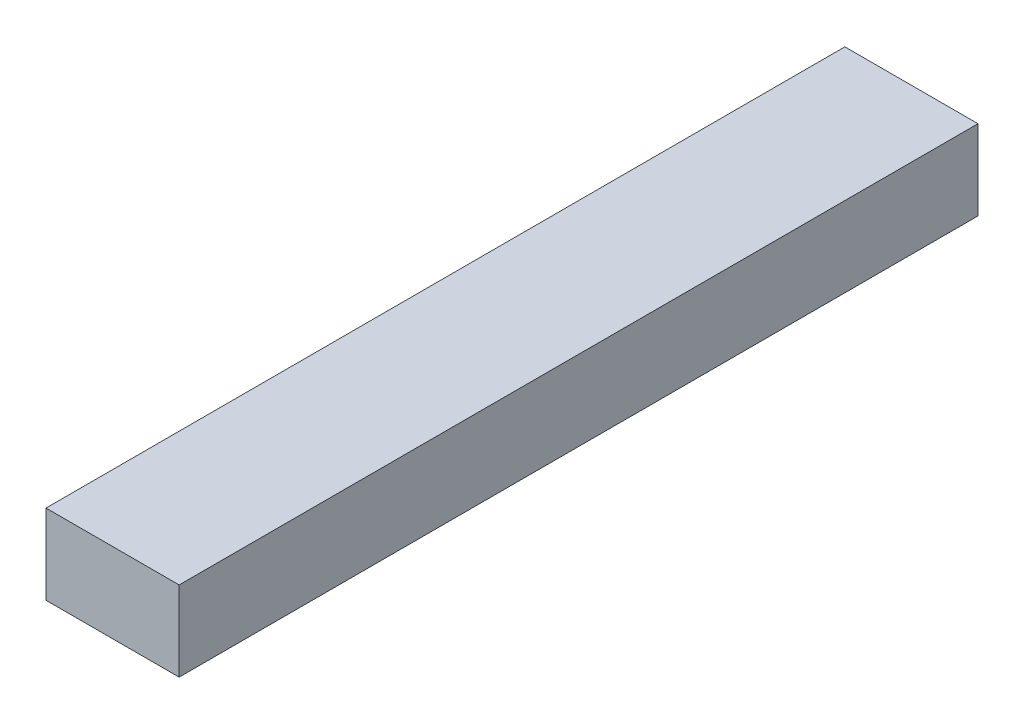
ISO-10303-21;
HEADER;
FILE_DESCRIPTION(('STEP AP214'),'2;1');
FILE_NAME('part.step','',(''),(''),'','','');
FILE_SCHEMA(('AUTOMOTIVE_DESIGN { 1 0 10303 214 1 1 1 1 }'));
ENDSEC;
DATA;
#1=APPLICATION_CONTEXT('core data for automotive mechanical design processes');
#2=APPLICATION_PROTOCOL_DEFINITION('international standard','automotive_design',2000,#1);
#3=PRODUCT_CONTEXT('',#1,'mechanical');
#4=PRODUCT('Part','Part','',(#3));
#5=PRODUCT_RELATED_PRODUCT_CATEGORY('part','',(#4));
#6=PRODUCT_DEFINITION_FORMATION('','',#4);
#7=PRODUCT_DEFINITION_CONTEXT('part definition',#1,'design');
#8=PRODUCT_DEFINITION('design','',#6,#7);
#9=PRODUCT_DEFINITION_SHAPE('','',#8);
#10=(LENGTH_UNIT() NAMED_UNIT(*) SI_UNIT(.MILLI.,.METRE.));
#11=(NAMED_UNIT(*) PLANE_ANGLE_UNIT() SI_UNIT($,.RADIAN.));
#12=(NAMED_UNIT(*) SI_UNIT($,.STERADIAN.) SOLID_ANGLE_UNIT());
#13=UNCERTAINTY_MEASURE_WITH_UNIT(LENGTH_MEASURE(1.E-05),#10,'distance_accuracy_value','');
#14=(GEOMETRIC_REPRESENTATION_CONTEXT(3) GLOBAL_UNCERTAINTY_ASSIGNED_CONTEXT((#13)) GLOBAL_UNIT_ASSIGNED_CONTEXT((#10,
#11,#12)) REPRESENTATION_CONTEXT('',''));
#15=CARTESIAN_POINT('',(0.,0.,0.));
#16=DIRECTION('',(0.,0.,1.));
#17=DIRECTION('',(1.,0.,0.));
#18=AXIS2_PLACEMENT_3D('',#15,#16,#17);
#19=CARTESIAN_POINT('',(-31.75,-19.05,190.5));
#20=DIRECTION('',(1.,0.,0.));
#21=DIRECTION('',(0.,0.,-1.));
#22=AXIS2_PLACEMENT_3D('',#19,#20,#21);
#23=PLANE('',#22);
#24=DIRECTION('',(0.,-1.,0.));
#25=VECTOR('',#24,1.);
#26=CARTESIAN_POINT('',(-31.75,-19.05,-190.5));
#27=LINE('',#26,#25);
#28=CARTESIAN_POINT('',(-31.75,19.05,-190.5));
#29=VERTEX_POINT('',#28);
#30=CARTESIAN_POINT('',(-31.75,-19.05,-190.5));
#31=VERTEX_POINT('',#30);
#32=EDGE_CURVE('E117',#29,#31,#27,.T.);
#33=ORIENTED_EDGE('',*,*,#32,.T.);
#34=DIRECTION('',(0.,0.,-1.));
#35=VECTOR('',#34,1.);
#36=CARTESIAN_POINT('',(-31.75,-19.05,190.5));
#37=LINE('',#36,#35);
#38=CARTESIAN_POINT('',(-31.75,-19.05,190.5));
#39=VERTEX_POINT('',#38);
#40=EDGE_CURVE('E11',#39,#31,#37,.T.);
#41=ORIENTED_EDGE('',*,*,#40,.F.);
#42=DIRECTION('',(0.,-1.,0.));
#43=VECTOR('',#42,1.);
#44=CARTESIAN_POINT('',(-31.75,-19.05,190.5));
#45=LINE('',#44,#43);
#46=CARTESIAN_POINT('',(-31.75,19.05,190.5));
#47=VERTEX_POINT('',#46);
#48=EDGE_CURVE('E101',#47,#39,#45,.T.);
#49=ORIENTED_EDGE('',*,*,#48,.F.);
#50=DIRECTION('',(0.,0.,-1.));
#51=VECTOR('',#50,1.);
#52=CARTESIAN_POINT('',(-31.75,19.05,190.5));
#53=LINE('',#52,#51);
#54=EDGE_CURVE('E113',#47,#29,#53,.T.);
#55=ORIENTED_EDGE('',*,*,#54,.T.);
#56=EDGE_LOOP('',(#33,#41,#49,#55));
#57=FACE_BOUND('',#56,.T.);
#58=ADVANCED_FACE('F49',(#57),#23,.F.);
#59=CARTESIAN_POINT('',(31.75,-19.05,190.5));
#60=DIRECTION('',(0.,1.,0.));
#61=DIRECTION('',(-1.,0.,0.));
#62=AXIS2_PLACEMENT_3D('',#59,#60,#61);
#63=PLANE('',#62);
#64=DIRECTION('',(1.,0.,0.));
#65=VECTOR('',#64,1.);
#66=CARTESIAN_POINT('',(31.75,-19.05,-190.5));
#67=LINE('',#66,#65);
#68=CARTESIAN_POINT('',(31.75,-19.05,-190.5));
#69=VERTEX_POINT('',#68);
#70=EDGE_CURVE('E106',#31,#69,#67,.T.);
#71=ORIENTED_EDGE('',*,*,#70,.T.);
#72=DIRECTION('',(0.,0.,-1.));
#73=VECTOR('',#72,1.);
#74=CARTESIAN_POINT('',(31.75,-19.05,190.5));
#75=LINE('',#74,#73);
#76=CARTESIAN_POINT('',(31.75,-19.05,190.5));
#77=VERTEX_POINT('',#76);
#78=EDGE_CURVE('E58',#77,#69,#75,.T.);
#79=ORIENTED_EDGE('',*,*,#78,.F.);
#80=DIRECTION('',(1.,0.,0.));
#81=VECTOR('',#80,1.);
#82=CARTESIAN_POINT('',(31.75,-19.05,190.5));
#83=LINE('',#82,#81);
#84=EDGE_CURVE('E96',#39,#77,#83,.T.);
#85=ORIENTED_EDGE('',*,*,#84,.F.);
#86=ORIENTED_EDGE('',*,*,#40,.T.);
#87=EDGE_LOOP('',(#71,#79,#85,#86));
#88=FACE_BOUND('',#87,.T.);
#89=ADVANCED_FACE('F105',(#88),#63,.F.);
#90=CARTESIAN_POINT('',(31.75,-19.05,190.5));
#91=DIRECTION('',(-1.,0.,0.));
#92=DIRECTION('',(0.,0.,1.));
#93=AXIS2_PLACEMENT_3D('',#90,#91,#92);
#94=PLANE('',#93);
#95=DIRECTION('',(0.,1.,0.));
#96=VECTOR('',#95,1.);
#97=CARTESIAN_POINT('',(31.75,-19.05,-190.5));
#98=LINE('',#97,#96);
#99=CARTESIAN_POINT('',(31.75,19.05,-190.5));
#100=VERTEX_POINT('',#99);
#101=EDGE_CURVE('E83',#69,#100,#98,.T.);
#102=ORIENTED_EDGE('',*,*,#101,.T.);
#103=DIRECTION('',(0.,0.,-1.));
#104=VECTOR('',#103,1.);
#105=CARTESIAN_POINT('',(31.75,19.05,190.5));
#106=LINE('',#105,#104);
#107=CARTESIAN_POINT('',(31.75,19.05,190.5));
#108=VERTEX_POINT('',#107);
#109=EDGE_CURVE('E108',#108,#100,#106,.T.);
#110=ORIENTED_EDGE('',*,*,#109,.F.);
#111=DIRECTION('',(0.,1.,0.));
#112=VECTOR('',#111,1.);
#113=CARTESIAN_POINT('',(31.75,-19.05,190.5));
#114=LINE('',#113,#112);
#115=EDGE_CURVE('E99',#77,#108,#114,.T.);
#116=ORIENTED_EDGE('',*,*,#115,.F.);
#117=ORIENTED_EDGE('',*,*,#78,.T.);
#118=EDGE_LOOP('',(#102,#110,#116,#117));
#119=FACE_BOUND('',#118,.T.);
#120=ADVANCED_FACE('F109',(#119),#94,.F.);
#121=CARTESIAN_POINT('',(31.75,19.05,190.5));
#122=DIRECTION('',(0.,-1.,0.));
#123=DIRECTION('',(1.,0.,0.));
#124=AXIS2_PLACEMENT_3D('',#121,#122,#123);
#125=PLANE('',#124);
#126=DIRECTION('',(-1.,0.,0.));
#127=VECTOR('',#126,1.);
#128=CARTESIAN_POINT('',(31.75,19.05,-190.5));
#129=LINE('',#128,#127);
#130=EDGE_CURVE('E89',#100,#29,#129,.T.);
#131=ORIENTED_EDGE('',*,*,#130,.T.);
#132=ORIENTED_EDGE('',*,*,#54,.F.);
#133=DIRECTION('',(-1.,0.,0.));
#134=VECTOR('',#133,1.);
#135=CARTESIAN_POINT('',(31.75,19.05,190.5));
#136=LINE('',#135,#134);
#137=EDGE_CURVE('E66',#108,#47,#136,.T.);
#138=ORIENTED_EDGE('',*,*,#137,.F.);
#139=ORIENTED_EDGE('',*,*,#109,.T.);
#140=EDGE_LOOP('',(#131,#132,#138,#139));
#141=FACE_BOUND('',#140,.T.);
#142=ADVANCED_FACE('F130',(#141),#125,.F.);
#143=CARTESIAN_POINT('',(0.,0.,190.5));
#144=DIRECTION('',(0.,0.,1.));
#145=DIRECTION('',(1.,0.,0.));
#146=AXIS2_PLACEMENT_3D('',#143,#144,#145);
#147=PLANE('',#146);
#148=ORIENTED_EDGE('',*,*,#48,.T.);
#149=ORIENTED_EDGE('',*,*,#84,.T.);
#150=ORIENTED_EDGE('',*,*,#115,.T.);
#151=ORIENTED_EDGE('',*,*,#137,.T.);
#152=EDGE_LOOP('',(#148,#149,#150,#151));
#153=FACE_BOUND('',#152,.T.);
#154=ADVANCED_FACE('F97',(#153),#147,.T.);
#155=CARTESIAN_POINT('',(0.,0.,-190.5));
#156=DIRECTION('',(0.,0.,1.));
#157=DIRECTION('',(1.,0.,0.));
#158=AXIS2_PLACEMENT_3D('',#155,#156,#157);
#159=PLANE('',#158);
#160=ORIENTED_EDGE('',*,*,#32,.F.);
#161=ORIENTED_EDGE('',*,*,#130,.F.);
#162=ORIENTED_EDGE('',*,*,#101,.F.);
#163=ORIENTED_EDGE('',*,*,#70,.F.);
#164=EDGE_LOOP('',(#160,#161,#162,#163));
#165=FACE_BOUND('',#164,.T.);
#166=ADVANCED_FACE('F133',(#165),#159,.F.);
#167=CLOSED_SHELL('',(#58,#89,#120,#142,#154,#166));
#168=MANIFOLD_SOLID_BREP('B2',#167);
#169=ADVANCED_BREP_SHAPE_REPRESENTATION('',(#18,#168),#14);
#170=SHAPE_DEFINITION_REPRESENTATION(#9,#169);
ENDSEC;
END-ISO-10303-21;
